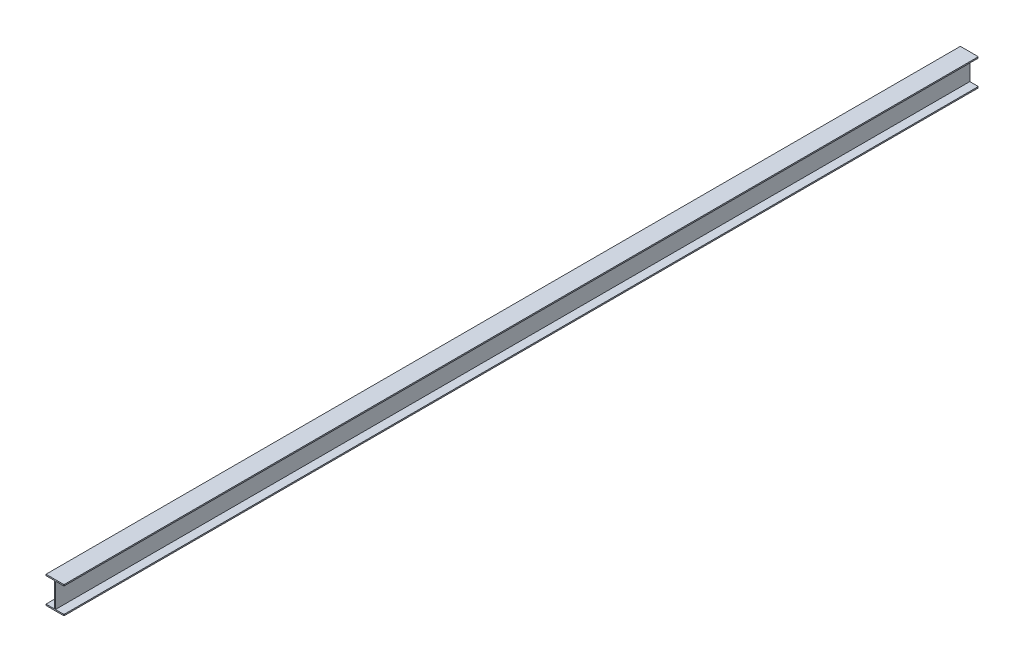
ISO-10303-21;
HEADER;
FILE_DESCRIPTION(('STEP AP214'),'2;1');
FILE_NAME('part.step','',(''),(''),'','','');
FILE_SCHEMA(('AUTOMOTIVE_DESIGN { 1 0 10303 214 1 1 1 1 }'));
ENDSEC;
DATA;
#1=APPLICATION_CONTEXT('core data for automotive mechanical design processes');
#2=APPLICATION_PROTOCOL_DEFINITION('international standard','automotive_design',2000,#1);
#3=PRODUCT_CONTEXT('',#1,'mechanical');
#4=PRODUCT('Part','Part','',(#3));
#5=PRODUCT_RELATED_PRODUCT_CATEGORY('part','',(#4));
#6=PRODUCT_DEFINITION_FORMATION('','',#4);
#7=PRODUCT_DEFINITION_CONTEXT('part definition',#1,'design');
#8=PRODUCT_DEFINITION('design','',#6,#7);
#9=PRODUCT_DEFINITION_SHAPE('','',#8);
#10=(LENGTH_UNIT() NAMED_UNIT(*) SI_UNIT(.MILLI.,.METRE.));
#11=(NAMED_UNIT(*) PLANE_ANGLE_UNIT() SI_UNIT($,.RADIAN.));
#12=(NAMED_UNIT(*) SI_UNIT($,.STERADIAN.) SOLID_ANGLE_UNIT());
#13=UNCERTAINTY_MEASURE_WITH_UNIT(LENGTH_MEASURE(1.E-05),#10,'distance_accuracy_value','');
#14=(GEOMETRIC_REPRESENTATION_CONTEXT(3) GLOBAL_UNCERTAINTY_ASSIGNED_CONTEXT((#13)) GLOBAL_UNIT_ASSIGNED_CONTEXT((#10,
#11,#12)) REPRESENTATION_CONTEXT('',''));
#15=CARTESIAN_POINT('',(0.,0.,0.));
#16=DIRECTION('',(0.,0.,1.));
#17=DIRECTION('',(1.,0.,0.));
#18=AXIS2_PLACEMENT_3D('',#15,#16,#17);
#19=CARTESIAN_POINT('',(101.6,-153.162240532958,5168.81608));
#20=DIRECTION('',(0.,1.,0.));
#21=DIRECTION('',(0.,0.,1.));
#22=AXIS2_PLACEMENT_3D('',#19,#20,#21);
#23=PLANE('',#22);
#24=DIRECTION('',(0.,0.,-1.));
#25=VECTOR('',#24,1.);
#26=CARTESIAN_POINT('',(101.6,-153.162240532958,5168.81608));
#27=LINE('',#26,#25);
#28=CARTESIAN_POINT('',(101.6,-153.162240532958,5165.64108));
#29=VERTEX_POINT('',#28);
#30=CARTESIAN_POINT('',(101.6,-153.162240532958,2736.80804));
#31=VERTEX_POINT('',#30);
#32=EDGE_CURVE('E278',#29,#31,#27,.T.);
#33=ORIENTED_EDGE('',*,*,#32,.F.);
#34=CARTESIAN_POINT('',(98.425,-153.162240532958,5165.64108));
#35=DIRECTION('',(0.,1.,0.));
#36=DIRECTION('',(0.,0.,1.));
#37=AXIS2_PLACEMENT_3D('',#34,#35,#36);
#38=CIRCLE('',#37,3.175);
#39=CARTESIAN_POINT('',(98.425,-153.162240532958,5168.81608));
#40=VERTEX_POINT('',#39);
#41=EDGE_CURVE('E232',#29,#40,#38,.F.);
#42=ORIENTED_EDGE('',*,*,#41,.T.);
#43=DIRECTION('',(1.,0.,0.));
#44=VECTOR('',#43,1.);
#45=CARTESIAN_POINT('',(101.6,-153.162240532958,5168.81608));
#46=LINE('',#45,#44);
#47=CARTESIAN_POINT('',(0.,-153.162240532958,5168.81608));
#48=VERTEX_POINT('',#47);
#49=EDGE_CURVE('E322',#48,#40,#46,.T.);
#50=ORIENTED_EDGE('',*,*,#49,.F.);
#51=DIRECTION('',(0.,0.,-1.));
#52=VECTOR('',#51,1.);
#53=CARTESIAN_POINT('',(0.,-153.162240532958,5168.81608));
#54=LINE('',#53,#52);
#55=CARTESIAN_POINT('',(0.,-153.162240532958,2736.80804));
#56=VERTEX_POINT('',#55);
#57=EDGE_CURVE('E282',#48,#56,#54,.T.);
#58=ORIENTED_EDGE('',*,*,#57,.T.);
#59=DIRECTION('',(-1.,0.,0.));
#60=VECTOR('',#59,1.);
#61=CARTESIAN_POINT('',(101.6,-153.162240532958,2736.80804));
#62=LINE('',#61,#60);
#63=EDGE_CURVE('E197',#31,#56,#62,.T.);
#64=ORIENTED_EDGE('',*,*,#63,.F.);
#65=EDGE_LOOP('',(#33,#42,#50,#58,#64));
#66=FACE_BOUND('',#65,.T.);
#67=ADVANCED_FACE('F39',(#66),#23,.F.);
#68=DIRECTION('',(1.,0.,0.));
#69=VECTOR('',#68,1.);
#70=CARTESIAN_POINT('',(101.6,-153.162240532958,0.));
#71=LINE('',#70,#69);
#72=CARTESIAN_POINT('',(0.,-153.162240532958,0.));
#73=VERTEX_POINT('',#72);
#74=CARTESIAN_POINT('',(98.425,-153.162240532958,0.));
#75=VERTEX_POINT('',#74);
#76=EDGE_CURVE('E304',#73,#75,#71,.T.);
#77=ORIENTED_EDGE('',*,*,#76,.T.);
#78=CARTESIAN_POINT('',(98.425,-153.162240532958,3.17499999999971));
#79=DIRECTION('',(0.,1.,0.));
#80=DIRECTION('',(0.,0.,1.));
#81=AXIS2_PLACEMENT_3D('',#78,#79,#80);
#82=CIRCLE('',#81,3.175);
#83=CARTESIAN_POINT('',(101.6,-153.162240532958,3.17499999999971));
#84=VERTEX_POINT('',#83);
#85=EDGE_CURVE('E11',#75,#84,#82,.F.);
#86=ORIENTED_EDGE('',*,*,#85,.T.);
#87=CARTESIAN_POINT('',(101.6,-153.162240532958,2432.00804));
#88=VERTEX_POINT('',#87);
#89=EDGE_CURVE('E277',#88,#84,#27,.T.);
#90=ORIENTED_EDGE('',*,*,#89,.F.);
#91=DIRECTION('',(1.,0.,0.));
#92=VECTOR('',#91,1.);
#93=CARTESIAN_POINT('',(101.6,-153.162240532958,2432.00804));
#94=LINE('',#93,#92);
#95=CARTESIAN_POINT('',(0.,-153.162240532958,2432.00804));
#96=VERTEX_POINT('',#95);
#97=EDGE_CURVE('E194',#96,#88,#94,.T.);
#98=ORIENTED_EDGE('',*,*,#97,.F.);
#99=EDGE_CURVE('E280',#96,#73,#54,.T.);
#100=ORIENTED_EDGE('',*,*,#99,.T.);
#101=EDGE_LOOP('',(#77,#86,#90,#98,#100));
#102=FACE_BOUND('',#101,.T.);
#103=ADVANCED_FACE('F339',(#102),#23,.F.);
#104=CARTESIAN_POINT('',(0.,-7.11224053295814,5168.81608));
#105=DIRECTION('',(1.,0.,0.));
#106=DIRECTION('',(0.,0.,-1.));
#107=AXIS2_PLACEMENT_3D('',#104,#105,#106);
#108=PLANE('',#107);
#109=DIRECTION('',(0.,-1.,0.));
#110=VECTOR('',#109,1.);
#111=CARTESIAN_POINT('',(0.,-7.11224053295814,0.));
#112=LINE('',#111,#110);
#113=CARTESIAN_POINT('',(0.,-0.000240532958142959,0.));
#114=VERTEX_POINT('',#113);
#115=CARTESIAN_POINT('',(0.,-7.11224053295814,0.));
#116=VERTEX_POINT('',#115);
#117=EDGE_CURVE('E193',#114,#116,#112,.T.);
#118=ORIENTED_EDGE('',*,*,#117,.T.);
#119=DIRECTION('',(0.,0.,-1.));
#120=VECTOR('',#119,1.);
#121=CARTESIAN_POINT('',(0.,-7.11224053295814,5168.81608));
#122=LINE('',#121,#120);
#123=CARTESIAN_POINT('',(0.,-7.11224053295814,5168.81608));
#124=VERTEX_POINT('',#123);
#125=EDGE_CURVE('E171',#124,#116,#122,.T.);
#126=ORIENTED_EDGE('',*,*,#125,.F.);
#127=DIRECTION('',(0.,-1.,0.));
#128=VECTOR('',#127,1.);
#129=CARTESIAN_POINT('',(0.,-7.11224053295814,5168.81608));
#130=LINE('',#129,#128);
#131=CARTESIAN_POINT('',(0.,-0.000240532958142959,5168.81608));
#132=VERTEX_POINT('',#131);
#133=EDGE_CURVE('E178',#132,#124,#130,.T.);
#134=ORIENTED_EDGE('',*,*,#133,.F.);
#135=DIRECTION('',(0.,0.,-1.));
#136=VECTOR('',#135,1.);
#137=CARTESIAN_POINT('',(0.,-0.000240532958142959,5168.81608));
#138=LINE('',#137,#136);
#139=EDGE_CURVE('E264',#132,#114,#138,.T.);
#140=ORIENTED_EDGE('',*,*,#139,.T.);
#141=EDGE_LOOP('',(#118,#126,#134,#140));
#142=FACE_BOUND('',#141,.T.);
#143=ADVANCED_FACE('F191',(#142),#108,.F.);
#144=CARTESIAN_POINT('',(47.5660357142857,-7.11224053295814,5168.81608));
#145=DIRECTION('',(0.,1.,0.));
#146=DIRECTION('',(-1.,0.,0.));
#147=AXIS2_PLACEMENT_3D('',#144,#145,#146);
#148=PLANE('',#147);
#149=DIRECTION('',(1.,0.,0.));
#150=VECTOR('',#149,1.);
#151=CARTESIAN_POINT('',(47.5660357142857,-7.11224053295814,0.));
#152=LINE('',#151,#150);
#153=CARTESIAN_POINT('',(47.5660357142857,-7.11224053295814,0.));
#154=VERTEX_POINT('',#153);
#155=EDGE_CURVE('E306',#116,#154,#152,.T.);
#156=ORIENTED_EDGE('',*,*,#155,.T.);
#157=DIRECTION('',(0.,0.,-1.));
#158=VECTOR('',#157,1.);
#159=CARTESIAN_POINT('',(47.5660357142857,-7.11224053295814,5168.81608));
#160=LINE('',#159,#158);
#161=CARTESIAN_POINT('',(47.5660357142857,-7.11224053295814,5168.81608));
#162=VERTEX_POINT('',#161);
#163=EDGE_CURVE('E174',#162,#154,#160,.T.);
#164=ORIENTED_EDGE('',*,*,#163,.F.);
#165=DIRECTION('',(1.,0.,0.));
#166=VECTOR('',#165,1.);
#167=CARTESIAN_POINT('',(47.5660357142857,-7.11224053295814,5168.81608));
#168=LINE('',#167,#166);
#169=EDGE_CURVE('E167',#124,#162,#168,.T.);
#170=ORIENTED_EDGE('',*,*,#169,.F.);
#171=ORIENTED_EDGE('',*,*,#125,.T.);
#172=EDGE_LOOP('',(#156,#164,#170,#171));
#173=FACE_BOUND('',#172,.T.);
#174=ADVANCED_FACE('F169',(#173),#148,.F.);
#175=CARTESIAN_POINT('',(47.5660357142857,-146.050240532958,5168.81608));
#176=DIRECTION('',(1.,0.,0.));
#177=DIRECTION('',(0.,0.,-1.));
#178=AXIS2_PLACEMENT_3D('',#175,#176,#177);
#179=PLANE('',#178);
#180=DIRECTION('',(0.,-1.,0.));
#181=VECTOR('',#180,1.);
#182=CARTESIAN_POINT('',(47.5660357142857,-146.050240532958,0.));
#183=LINE('',#182,#181);
#184=CARTESIAN_POINT('',(47.5660357142857,-146.050240532958,0.));
#185=VERTEX_POINT('',#184);
#186=EDGE_CURVE('E300',#154,#185,#183,.T.);
#187=ORIENTED_EDGE('',*,*,#186,.T.);
#188=DIRECTION('',(0.,0.,-1.));
#189=VECTOR('',#188,1.);
#190=CARTESIAN_POINT('',(47.5660357142857,-146.050240532958,5168.81608));
#191=LINE('',#190,#189);
#192=CARTESIAN_POINT('',(47.5660357142857,-146.050240532958,5168.81608));
#193=VERTEX_POINT('',#192);
#194=EDGE_CURVE('E199',#193,#185,#191,.T.);
#195=ORIENTED_EDGE('',*,*,#194,.F.);
#196=DIRECTION('',(0.,-1.,0.));
#197=VECTOR('',#196,1.);
#198=CARTESIAN_POINT('',(47.5660357142857,-146.050240532958,5168.81608));
#199=LINE('',#198,#197);
#200=EDGE_CURVE('E177',#162,#193,#199,.T.);
#201=ORIENTED_EDGE('',*,*,#200,.F.);
#202=ORIENTED_EDGE('',*,*,#163,.T.);
#203=EDGE_LOOP('',(#187,#195,#201,#202));
#204=FACE_BOUND('',#203,.T.);
#205=ADVANCED_FACE('F328',(#204),#179,.F.);
#206=CARTESIAN_POINT('',(0.,-146.050240532958,5168.81608));
#207=DIRECTION('',(0.,-1.,0.));
#208=DIRECTION('',(1.,0.,0.));
#209=AXIS2_PLACEMENT_3D('',#206,#207,#208);
#210=PLANE('',#209);
#211=DIRECTION('',(-1.,0.,0.));
#212=VECTOR('',#211,1.);
#213=CARTESIAN_POINT('',(0.,-146.050240532958,0.));
#214=LINE('',#213,#212);
#215=CARTESIAN_POINT('',(0.,-146.050240532958,0.));
#216=VERTEX_POINT('',#215);
#217=EDGE_CURVE('E295',#185,#216,#214,.T.);
#218=ORIENTED_EDGE('',*,*,#217,.T.);
#219=DIRECTION('',(0.,0.,-1.));
#220=VECTOR('',#219,1.);
#221=CARTESIAN_POINT('',(0.,-146.050240532958,5168.81608));
#222=LINE('',#221,#220);
#223=CARTESIAN_POINT('',(0.,-146.050240532958,5168.81608));
#224=VERTEX_POINT('',#223);
#225=EDGE_CURVE('E285',#224,#216,#222,.T.);
#226=ORIENTED_EDGE('',*,*,#225,.F.);
#227=DIRECTION('',(-1.,0.,0.));
#228=VECTOR('',#227,1.);
#229=CARTESIAN_POINT('',(0.,-146.050240532958,5168.81608));
#230=LINE('',#229,#228);
#231=EDGE_CURVE('E296',#193,#224,#230,.T.);
#232=ORIENTED_EDGE('',*,*,#231,.F.);
#233=ORIENTED_EDGE('',*,*,#194,.T.);
#234=EDGE_LOOP('',(#218,#226,#232,#233));
#235=FACE_BOUND('',#234,.T.);
#236=ADVANCED_FACE('F293',(#235),#210,.F.);
#237=CARTESIAN_POINT('',(0.,-153.162240532958,5168.81608));
#238=DIRECTION('',(1.,0.,0.));
#239=DIRECTION('',(0.,0.,-1.));
#240=AXIS2_PLACEMENT_3D('',#237,#238,#239);
#241=PLANE('',#240);
#242=DIRECTION('',(0.,-1.,0.));
#243=VECTOR('',#242,1.);
#244=CARTESIAN_POINT('',(0.,-153.162240532958,0.));
#245=LINE('',#244,#243);
#246=EDGE_CURVE('E302',#216,#73,#245,.T.);
#247=ORIENTED_EDGE('',*,*,#246,.T.);
#248=ORIENTED_EDGE('',*,*,#99,.F.);
#249=EDGE_CURVE('E286',#56,#96,#54,.T.);
#250=ORIENTED_EDGE('',*,*,#249,.F.);
#251=ORIENTED_EDGE('',*,*,#57,.F.);
#252=DIRECTION('',(0.,-1.,0.));
#253=VECTOR('',#252,1.);
#254=CARTESIAN_POINT('',(0.,-153.162240532958,5168.81608));
#255=LINE('',#254,#253);
#256=EDGE_CURVE('E325',#224,#48,#255,.T.);
#257=ORIENTED_EDGE('',*,*,#256,.F.);
#258=ORIENTED_EDGE('',*,*,#225,.T.);
#259=EDGE_LOOP('',(#247,#248,#250,#251,#257,#258));
#260=FACE_BOUND('',#259,.T.);
#261=ADVANCED_FACE('F335',(#260),#241,.F.);
#262=CARTESIAN_POINT('',(101.6,-153.162240532958,2584.40804));
#263=VERTEX_POINT('',#262);
#264=EDGE_CURVE('E281',#31,#263,#27,.T.);
#265=ORIENTED_EDGE('',*,*,#264,.F.);
#266=ORIENTED_EDGE('',*,*,#63,.T.);
#267=ORIENTED_EDGE('',*,*,#249,.T.);
#268=ORIENTED_EDGE('',*,*,#97,.T.);
#269=EDGE_CURVE('E366',#263,#88,#27,.T.);
#270=ORIENTED_EDGE('',*,*,#269,.F.);
#271=EDGE_LOOP('',(#265,#266,#267,#268,#270));
#272=FACE_BOUND('',#271,.T.);
#273=ADVANCED_FACE('F342',(#272),#23,.F.);
#274=CARTESIAN_POINT('',(101.6,-146.050240532958,5168.81608));
#275=DIRECTION('',(-1.,0.,0.));
#276=DIRECTION('',(0.,0.,1.));
#277=AXIS2_PLACEMENT_3D('',#274,#275,#276);
#278=PLANE('',#277);
#279=DIRECTION('',(0.,0.,-1.));
#280=VECTOR('',#279,1.);
#281=CARTESIAN_POINT('',(101.6,-146.050240532958,5168.81608));
#282=LINE('',#281,#280);
#283=CARTESIAN_POINT('',(101.6,-146.050240532958,5165.64108));
#284=VERTEX_POINT('',#283);
#285=CARTESIAN_POINT('',(101.6,-146.050240532958,3.17499999999971));
#286=VERTEX_POINT('',#285);
#287=EDGE_CURVE('E274',#284,#286,#282,.T.);
#288=ORIENTED_EDGE('',*,*,#287,.F.);
#289=DIRECTION('',(0.,1.,0.));
#290=VECTOR('',#289,1.);
#291=CARTESIAN_POINT('',(101.6,-146.050240532958,5165.64108));
#292=LINE('',#291,#290);
#293=EDGE_CURVE('E230',#284,#29,#292,.F.);
#294=ORIENTED_EDGE('',*,*,#293,.T.);
#295=ORIENTED_EDGE('',*,*,#32,.T.);
#296=ORIENTED_EDGE('',*,*,#264,.T.);
#297=ORIENTED_EDGE('',*,*,#269,.T.);
#298=ORIENTED_EDGE('',*,*,#89,.T.);
#299=DIRECTION('',(0.,1.,0.));
#300=VECTOR('',#299,1.);
#301=CARTESIAN_POINT('',(101.6,-146.050240532958,3.17499999999971));
#302=LINE('',#301,#300);
#303=EDGE_CURVE('E227',#84,#286,#302,.T.);
#304=ORIENTED_EDGE('',*,*,#303,.T.);
#305=EDGE_LOOP('',(#288,#294,#295,#296,#297,#298,#304));
#306=FACE_BOUND('',#305,.T.);
#307=ADVANCED_FACE('F351',(#306),#278,.F.);
#308=CARTESIAN_POINT('',(53.4080357142857,-146.050240532958,5168.81608));
#309=DIRECTION('',(0.,-1.,0.));
#310=DIRECTION('',(1.,0.,0.));
#311=AXIS2_PLACEMENT_3D('',#308,#309,#310);
#312=PLANE('',#311);
#313=DIRECTION('',(-1.,0.,0.));
#314=VECTOR('',#313,1.);
#315=CARTESIAN_POINT('',(53.4080357142857,-146.050240532958,5168.81608));
#316=LINE('',#315,#314);
#317=CARTESIAN_POINT('',(98.425,-146.050240532958,5168.81608));
#318=VERTEX_POINT('',#317);
#319=CARTESIAN_POINT('',(53.4080357142857,-146.050240532958,5168.81608));
#320=VERTEX_POINT('',#319);
#321=EDGE_CURVE('E320',#318,#320,#316,.T.);
#322=ORIENTED_EDGE('',*,*,#321,.F.);
#323=CARTESIAN_POINT('',(98.425,-146.050240532958,5165.64108));
#324=DIRECTION('',(0.,-1.,0.));
#325=DIRECTION('',(1.,0.,0.));
#326=AXIS2_PLACEMENT_3D('',#323,#324,#325);
#327=CIRCLE('',#326,3.175);
#328=EDGE_CURVE('E225',#318,#284,#327,.F.);
#329=ORIENTED_EDGE('',*,*,#328,.T.);
#330=ORIENTED_EDGE('',*,*,#287,.T.);
#331=CARTESIAN_POINT('',(98.425,-146.050240532958,3.17499999999971));
#332=DIRECTION('',(0.,-1.,0.));
#333=DIRECTION('',(1.,0.,0.));
#334=AXIS2_PLACEMENT_3D('',#331,#332,#333);
#335=CIRCLE('',#334,3.175);
#336=CARTESIAN_POINT('',(98.425,-146.050240532958,0.));
#337=VERTEX_POINT('',#336);
#338=EDGE_CURVE('E223',#286,#337,#335,.F.);
#339=ORIENTED_EDGE('',*,*,#338,.T.);
#340=DIRECTION('',(-1.,0.,0.));
#341=VECTOR('',#340,1.);
#342=CARTESIAN_POINT('',(53.4080357142857,-146.050240532958,0.));
#343=LINE('',#342,#341);
#344=CARTESIAN_POINT('',(53.4080357142857,-146.050240532958,0.));
#345=VERTEX_POINT('',#344);
#346=EDGE_CURVE('E311',#337,#345,#343,.T.);
#347=ORIENTED_EDGE('',*,*,#346,.T.);
#348=DIRECTION('',(0.,0.,-1.));
#349=VECTOR('',#348,1.);
#350=CARTESIAN_POINT('',(53.4080357142857,-146.050240532958,5168.81608));
#351=LINE('',#350,#349);
#352=EDGE_CURVE('E271',#320,#345,#351,.T.);
#353=ORIENTED_EDGE('',*,*,#352,.F.);
#354=EDGE_LOOP('',(#322,#329,#330,#339,#347,#353));
#355=FACE_BOUND('',#354,.T.);
#356=ADVANCED_FACE('F357',(#355),#312,.F.);
#357=CARTESIAN_POINT('',(53.4080357142857,-7.11224053295815,5168.81608));
#358=DIRECTION('',(-1.,0.,0.));
#359=DIRECTION('',(0.,-1.,0.));
#360=AXIS2_PLACEMENT_3D('',#357,#358,#359);
#361=PLANE('',#360);
#362=DIRECTION('',(0.,1.,0.));
#363=VECTOR('',#362,1.);
#364=CARTESIAN_POINT('',(53.4080357142857,-7.11224053295815,0.));
#365=LINE('',#364,#363);
#366=CARTESIAN_POINT('',(53.4080357142857,-7.11224053295815,0.));
#367=VERTEX_POINT('',#366);
#368=EDGE_CURVE('E252',#345,#367,#365,.T.);
#369=ORIENTED_EDGE('',*,*,#368,.T.);
#370=DIRECTION('',(0.,0.,-1.));
#371=VECTOR('',#370,1.);
#372=CARTESIAN_POINT('',(53.4080357142857,-7.11224053295815,5168.81608));
#373=LINE('',#372,#371);
#374=CARTESIAN_POINT('',(53.4080357142857,-7.11224053295815,5168.81608));
#375=VERTEX_POINT('',#374);
#376=EDGE_CURVE('E251',#375,#367,#373,.T.);
#377=ORIENTED_EDGE('',*,*,#376,.F.);
#378=DIRECTION('',(0.,1.,0.));
#379=VECTOR('',#378,1.);
#380=CARTESIAN_POINT('',(53.4080357142857,-7.11224053295815,5168.81608));
#381=LINE('',#380,#379);
#382=EDGE_CURVE('E318',#320,#375,#381,.T.);
#383=ORIENTED_EDGE('',*,*,#382,.F.);
#384=ORIENTED_EDGE('',*,*,#352,.T.);
#385=EDGE_LOOP('',(#369,#377,#383,#384));
#386=FACE_BOUND('',#385,.T.);
#387=ADVANCED_FACE('F375',(#386),#361,.F.);
#388=CARTESIAN_POINT('',(101.6,-7.11224053295814,5168.81608));
#389=DIRECTION('',(0.,1.,0.));
#390=DIRECTION('',(-1.,0.,0.));
#391=AXIS2_PLACEMENT_3D('',#388,#389,#390);
#392=PLANE('',#391);
#393=DIRECTION('',(0.,0.,-1.));
#394=VECTOR('',#393,1.);
#395=CARTESIAN_POINT('',(101.6,-7.11224053295814,5168.81608));
#396=LINE('',#395,#394);
#397=CARTESIAN_POINT('',(101.6,-7.11224053295814,5165.64108));
#398=VERTEX_POINT('',#397);
#399=CARTESIAN_POINT('',(101.6,-7.11224053295814,3.17499999999971));
#400=VERTEX_POINT('',#399);
#401=EDGE_CURVE('E261',#398,#400,#396,.T.);
#402=ORIENTED_EDGE('',*,*,#401,.F.);
#403=CARTESIAN_POINT('',(98.425,-7.11224053295814,5165.64108));
#404=DIRECTION('',(0.,1.,0.));
#405=DIRECTION('',(-1.,0.,0.));
#406=AXIS2_PLACEMENT_3D('',#403,#404,#405);
#407=CIRCLE('',#406,3.175);
#408=CARTESIAN_POINT('',(98.425,-7.11224053295814,5168.81608));
#409=VERTEX_POINT('',#408);
#410=EDGE_CURVE('E221',#398,#409,#407,.F.);
#411=ORIENTED_EDGE('',*,*,#410,.T.);
#412=DIRECTION('',(1.,0.,0.));
#413=VECTOR('',#412,1.);
#414=CARTESIAN_POINT('',(101.6,-7.11224053295814,5168.81608));
#415=LINE('',#414,#413);
#416=EDGE_CURVE('E316',#375,#409,#415,.T.);
#417=ORIENTED_EDGE('',*,*,#416,.F.);
#418=ORIENTED_EDGE('',*,*,#376,.T.);
#419=DIRECTION('',(1.,0.,0.));
#420=VECTOR('',#419,1.);
#421=CARTESIAN_POINT('',(101.6,-7.11224053295814,0.));
#422=LINE('',#421,#420);
#423=CARTESIAN_POINT('',(98.425,-7.11224053295814,0.));
#424=VERTEX_POINT('',#423);
#425=EDGE_CURVE('E241',#367,#424,#422,.T.);
#426=ORIENTED_EDGE('',*,*,#425,.T.);
#427=CARTESIAN_POINT('',(98.425,-7.11224053295814,3.17499999999971));
#428=DIRECTION('',(0.,1.,0.));
#429=DIRECTION('',(-1.,0.,0.));
#430=AXIS2_PLACEMENT_3D('',#427,#428,#429);
#431=CIRCLE('',#430,3.175);
#432=EDGE_CURVE('E219',#424,#400,#431,.F.);
#433=ORIENTED_EDGE('',*,*,#432,.T.);
#434=EDGE_LOOP('',(#402,#411,#417,#418,#426,#433));
#435=FACE_BOUND('',#434,.T.);
#436=ADVANCED_FACE('F247',(#435),#392,.F.);
#437=CARTESIAN_POINT('',(101.6,-0.000240532958130516,5168.81608));
#438=DIRECTION('',(-1.,0.,0.));
#439=DIRECTION('',(0.,0.,1.));
#440=AXIS2_PLACEMENT_3D('',#437,#438,#439);
#441=PLANE('',#440);
#442=DIRECTION('',(0.,0.,-1.));
#443=VECTOR('',#442,1.);
#444=CARTESIAN_POINT('',(101.6,-0.000240532958130516,5168.81608));
#445=LINE('',#444,#443);
#446=CARTESIAN_POINT('',(101.6,-0.000240532958130516,5165.64108));
#447=VERTEX_POINT('',#446);
#448=CARTESIAN_POINT('',(101.6,-0.000240532958130516,3.17499999999971));
#449=VERTEX_POINT('',#448);
#450=EDGE_CURVE('E259',#447,#449,#445,.T.);
#451=ORIENTED_EDGE('',*,*,#450,.F.);
#452=DIRECTION('',(0.,1.,0.));
#453=VECTOR('',#452,1.);
#454=CARTESIAN_POINT('',(101.6,-0.000240532958130516,5165.64108));
#455=LINE('',#454,#453);
#456=EDGE_CURVE('E217',#447,#398,#455,.F.);
#457=ORIENTED_EDGE('',*,*,#456,.T.);
#458=ORIENTED_EDGE('',*,*,#401,.T.);
#459=DIRECTION('',(0.,1.,0.));
#460=VECTOR('',#459,1.);
#461=CARTESIAN_POINT('',(101.6,-0.000240532958130516,3.17499999999971));
#462=LINE('',#461,#460);
#463=EDGE_CURVE('E214',#400,#449,#462,.T.);
#464=ORIENTED_EDGE('',*,*,#463,.T.);
#465=EDGE_LOOP('',(#451,#457,#458,#464));
#466=FACE_BOUND('',#465,.T.);
#467=ADVANCED_FACE('F258',(#466),#441,.F.);
#468=CARTESIAN_POINT('',(0.,-0.000240532958142959,5168.81608));
#469=DIRECTION('',(0.,-1.,0.));
#470=DIRECTION('',(1.,0.,0.));
#471=AXIS2_PLACEMENT_3D('',#468,#469,#470);
#472=PLANE('',#471);
#473=DIRECTION('',(-1.,0.,0.));
#474=VECTOR('',#473,1.);
#475=CARTESIAN_POINT('',(0.,-0.000240532958142959,5168.81608));
#476=LINE('',#475,#474);
#477=CARTESIAN_POINT('',(98.425,-0.000240532958130905,5168.81608));
#478=VERTEX_POINT('',#477);
#479=EDGE_CURVE('E185',#478,#132,#476,.T.);
#480=ORIENTED_EDGE('',*,*,#479,.F.);
#481=CARTESIAN_POINT('',(98.425,-0.000240532958130905,5165.64108));
#482=DIRECTION('',(0.,-1.,0.));
#483=DIRECTION('',(1.,0.,0.));
#484=AXIS2_PLACEMENT_3D('',#481,#482,#483);
#485=CIRCLE('',#484,3.175);
#486=EDGE_CURVE('E212',#478,#447,#485,.F.);
#487=ORIENTED_EDGE('',*,*,#486,.T.);
#488=ORIENTED_EDGE('',*,*,#450,.T.);
#489=CARTESIAN_POINT('',(98.425,-0.000240532958130905,3.17499999999971));
#490=DIRECTION('',(0.,-1.,0.));
#491=DIRECTION('',(1.,0.,0.));
#492=AXIS2_PLACEMENT_3D('',#489,#490,#491);
#493=CIRCLE('',#492,3.175);
#494=CARTESIAN_POINT('',(98.425,-0.000240532958130905,0.));
#495=VERTEX_POINT('',#494);
#496=EDGE_CURVE('E210',#449,#495,#493,.F.);
#497=ORIENTED_EDGE('',*,*,#496,.T.);
#498=DIRECTION('',(-1.,0.,0.));
#499=VECTOR('',#498,1.);
#500=CARTESIAN_POINT('',(0.,-0.000240532958142959,0.));
#501=LINE('',#500,#499);
#502=EDGE_CURVE('E189',#495,#114,#501,.T.);
#503=ORIENTED_EDGE('',*,*,#502,.T.);
#504=ORIENTED_EDGE('',*,*,#139,.F.);
#505=EDGE_LOOP('',(#480,#487,#488,#497,#503,#504));
#506=FACE_BOUND('',#505,.T.);
#507=ADVANCED_FACE('F263',(#506),#472,.F.);
#508=CARTESIAN_POINT('',(0.,0.,5168.81608));
#509=DIRECTION('',(0.,0.,-1.));
#510=DIRECTION('',(-1.,0.,0.));
#511=AXIS2_PLACEMENT_3D('',#508,#509,#510);
#512=PLANE('',#511);
#513=ORIENTED_EDGE('',*,*,#416,.T.);
#514=DIRECTION('',(0.,1.,0.));
#515=VECTOR('',#514,1.);
#516=CARTESIAN_POINT('',(98.425,0.,5168.81608));
#517=LINE('',#516,#515);
#518=EDGE_CURVE('E208',#409,#478,#517,.T.);
#519=ORIENTED_EDGE('',*,*,#518,.T.);
#520=ORIENTED_EDGE('',*,*,#479,.T.);
#521=ORIENTED_EDGE('',*,*,#133,.T.);
#522=ORIENTED_EDGE('',*,*,#169,.T.);
#523=ORIENTED_EDGE('',*,*,#200,.T.);
#524=ORIENTED_EDGE('',*,*,#231,.T.);
#525=ORIENTED_EDGE('',*,*,#256,.T.);
#526=ORIENTED_EDGE('',*,*,#49,.T.);
#527=DIRECTION('',(0.,1.,0.));
#528=VECTOR('',#527,1.);
#529=CARTESIAN_POINT('',(98.425,0.,5168.81608));
#530=LINE('',#529,#528);
#531=EDGE_CURVE('E205',#40,#318,#530,.T.);
#532=ORIENTED_EDGE('',*,*,#531,.T.);
#533=ORIENTED_EDGE('',*,*,#321,.T.);
#534=ORIENTED_EDGE('',*,*,#382,.T.);
#535=EDGE_LOOP('',(#513,#519,#520,#521,#522,#523,#524,#525,#526,#532,#533,#534));
#536=FACE_BOUND('',#535,.T.);
#537=ADVANCED_FACE('F182',(#536),#512,.F.);
#538=CARTESIAN_POINT('',(0.,0.,0.));
#539=DIRECTION('',(0.,0.,-1.));
#540=DIRECTION('',(-1.,0.,0.));
#541=AXIS2_PLACEMENT_3D('',#538,#539,#540);
#542=PLANE('',#541);
#543=ORIENTED_EDGE('',*,*,#346,.F.);
#544=DIRECTION('',(0.,1.,0.));
#545=VECTOR('',#544,1.);
#546=CARTESIAN_POINT('',(98.425,-153.162240532958,0.));
#547=LINE('',#546,#545);
#548=EDGE_CURVE('E47',#337,#75,#547,.F.);
#549=ORIENTED_EDGE('',*,*,#548,.T.);
#550=ORIENTED_EDGE('',*,*,#76,.F.);
#551=ORIENTED_EDGE('',*,*,#246,.F.);
#552=ORIENTED_EDGE('',*,*,#217,.F.);
#553=ORIENTED_EDGE('',*,*,#186,.F.);
#554=ORIENTED_EDGE('',*,*,#155,.F.);
#555=ORIENTED_EDGE('',*,*,#117,.F.);
#556=ORIENTED_EDGE('',*,*,#502,.F.);
#557=DIRECTION('',(0.,1.,0.));
#558=VECTOR('',#557,1.);
#559=CARTESIAN_POINT('',(98.425,-7.11224053295814,0.));
#560=LINE('',#559,#558);
#561=EDGE_CURVE('E234',#495,#424,#560,.F.);
#562=ORIENTED_EDGE('',*,*,#561,.T.);
#563=ORIENTED_EDGE('',*,*,#425,.F.);
#564=ORIENTED_EDGE('',*,*,#368,.F.);
#565=EDGE_LOOP('',(#543,#549,#550,#551,#552,#553,#554,#555,#556,#562,#563,#564));
#566=FACE_BOUND('',#565,.T.);
#567=ADVANCED_FACE('F239',(#566),#542,.T.);
#568=CARTESIAN_POINT('',(98.425,0.,5165.64108));
#569=DIRECTION('',(0.,1.,0.));
#570=DIRECTION('',(0.,0.,1.));
#571=AXIS2_PLACEMENT_3D('',#568,#569,#570);
#572=CYLINDRICAL_SURFACE('',#571,3.175);
#573=ORIENTED_EDGE('',*,*,#410,.F.);
#574=ORIENTED_EDGE('',*,*,#456,.F.);
#575=ORIENTED_EDGE('',*,*,#486,.F.);
#576=ORIENTED_EDGE('',*,*,#518,.F.);
#577=EDGE_LOOP('',(#573,#574,#575,#576));
#578=FACE_BOUND('',#577,.T.);
#579=ADVANCED_FACE('F387',(#578),#572,.T.);
#580=CARTESIAN_POINT('',(98.425,0.,5165.64108));
#581=DIRECTION('',(0.,1.,0.));
#582=DIRECTION('',(0.,0.,1.));
#583=AXIS2_PLACEMENT_3D('',#580,#581,#582);
#584=CYLINDRICAL_SURFACE('',#583,3.175);
#585=ORIENTED_EDGE('',*,*,#41,.F.);
#586=ORIENTED_EDGE('',*,*,#293,.F.);
#587=ORIENTED_EDGE('',*,*,#328,.F.);
#588=ORIENTED_EDGE('',*,*,#531,.F.);
#589=EDGE_LOOP('',(#585,#586,#587,#588));
#590=FACE_BOUND('',#589,.T.);
#591=ADVANCED_FACE('F381',(#590),#584,.T.);
#592=CARTESIAN_POINT('',(98.425,-146.050240532958,3.17499999999971));
#593=DIRECTION('',(0.,-1.,0.));
#594=DIRECTION('',(0.,0.,-1.));
#595=AXIS2_PLACEMENT_3D('',#592,#593,#594);
#596=CYLINDRICAL_SURFACE('',#595,3.175);
#597=ORIENTED_EDGE('',*,*,#85,.F.);
#598=ORIENTED_EDGE('',*,*,#548,.F.);
#599=ORIENTED_EDGE('',*,*,#338,.F.);
#600=ORIENTED_EDGE('',*,*,#303,.F.);
#601=EDGE_LOOP('',(#597,#598,#599,#600));
#602=FACE_BOUND('',#601,.T.);
#603=ADVANCED_FACE('F370',(#602),#596,.T.);
#604=CARTESIAN_POINT('',(98.425,-0.000240532958130516,3.17499999999971));
#605=DIRECTION('',(0.,-1.,0.));
#606=DIRECTION('',(0.,0.,-1.));
#607=AXIS2_PLACEMENT_3D('',#604,#605,#606);
#608=CYLINDRICAL_SURFACE('',#607,3.175);
#609=ORIENTED_EDGE('',*,*,#432,.F.);
#610=ORIENTED_EDGE('',*,*,#561,.F.);
#611=ORIENTED_EDGE('',*,*,#496,.F.);
#612=ORIENTED_EDGE('',*,*,#463,.F.);
#613=EDGE_LOOP('',(#609,#610,#611,#612));
#614=FACE_BOUND('',#613,.T.);
#615=ADVANCED_FACE('F41',(#614),#608,.T.);
#616=CLOSED_SHELL('',(#67,#103,#143,#174,#205,#236,#261,#273,#307,#356,#387,#436,#467,#507,#537,
#567,#579,#591,#603,#615));
#617=MANIFOLD_SOLID_BREP('B2',#616);
#618=ADVANCED_BREP_SHAPE_REPRESENTATION('',(#18,#617),#14);
#619=SHAPE_DEFINITION_REPRESENTATION(#9,#618);
ENDSEC;
END-ISO-10303-21;
